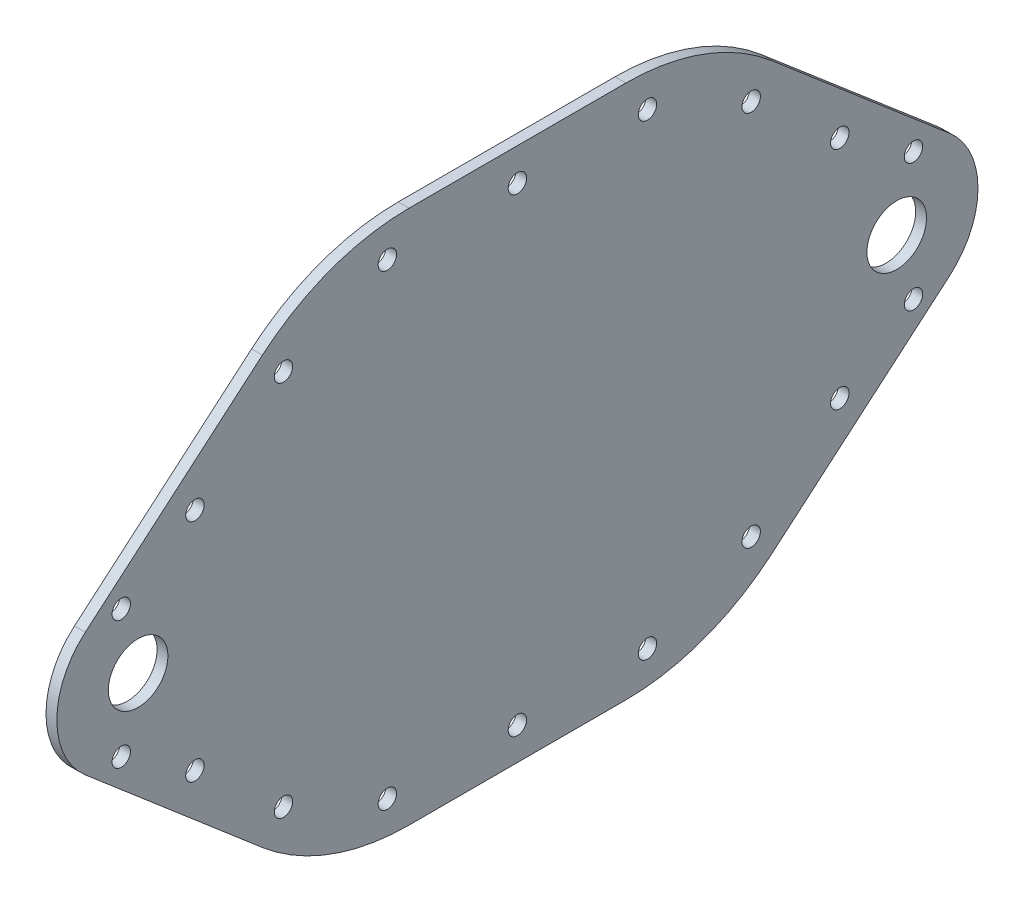
ISO-10303-21;
HEADER;
FILE_DESCRIPTION(('STEP AP214'),'2;1');
FILE_NAME('part.step','',(''),(''),'','','');
FILE_SCHEMA(('AUTOMOTIVE_DESIGN { 1 0 10303 214 1 1 1 1 }'));
ENDSEC;
DATA;
#1=APPLICATION_CONTEXT('core data for automotive mechanical design processes');
#2=APPLICATION_PROTOCOL_DEFINITION('international standard','automotive_design',2000,#1);
#3=PRODUCT_CONTEXT('',#1,'mechanical');
#4=PRODUCT('Part','Part','',(#3));
#5=PRODUCT_RELATED_PRODUCT_CATEGORY('part','',(#4));
#6=PRODUCT_DEFINITION_FORMATION('','',#4);
#7=PRODUCT_DEFINITION_CONTEXT('part definition',#1,'design');
#8=PRODUCT_DEFINITION('design','',#6,#7);
#9=PRODUCT_DEFINITION_SHAPE('','',#8);
#10=(LENGTH_UNIT() NAMED_UNIT(*) SI_UNIT(.MILLI.,.METRE.));
#11=(NAMED_UNIT(*) PLANE_ANGLE_UNIT() SI_UNIT($,.RADIAN.));
#12=(NAMED_UNIT(*) SI_UNIT($,.STERADIAN.) SOLID_ANGLE_UNIT());
#13=UNCERTAINTY_MEASURE_WITH_UNIT(LENGTH_MEASURE(1.E-05),#10,'distance_accuracy_value','');
#14=(GEOMETRIC_REPRESENTATION_CONTEXT(3) GLOBAL_UNCERTAINTY_ASSIGNED_CONTEXT((#13)) GLOBAL_UNIT_ASSIGNED_CONTEXT((#10,
#11,#12)) REPRESENTATION_CONTEXT('',''));
#15=CARTESIAN_POINT('',(0.,0.,0.));
#16=DIRECTION('',(0.,0.,1.));
#17=DIRECTION('',(1.,0.,0.));
#18=AXIS2_PLACEMENT_3D('',#15,#16,#17);
#19=CARTESIAN_POINT('',(2.54,0.,0.));
#20=DIRECTION('',(1.,0.,0.));
#21=DIRECTION('',(0.,0.,-1.));
#22=AXIS2_PLACEMENT_3D('',#19,#20,#21);
#23=PLANE('',#22);
#24=CARTESIAN_POINT('',(2.54,0.,88.9000000000001));
#25=DIRECTION('',(1.,0.,0.));
#26=DIRECTION('',(0.,0.,-1.));
#27=AXIS2_PLACEMENT_3D('',#24,#25,#26);
#28=CIRCLE('',#27,6.98500000000001);
#29=CARTESIAN_POINT('',(2.54,0.,81.915));
#30=VERTEX_POINT('',#29);
#31=EDGE_CURVE('E243',#30,#30,#28,.T.);
#32=ORIENTED_EDGE('',*,*,#31,.F.);
#33=EDGE_LOOP('',(#32));
#34=FACE_BOUND('',#33,.T.);
#35=CARTESIAN_POINT('',(2.54,-1.07621984650563E-05,-88.8999999999998));
#36=DIRECTION('',(1.,0.,0.));
#37=DIRECTION('',(0.,0.,-1.));
#38=AXIS2_PLACEMENT_3D('',#35,#36,#37);
#39=CIRCLE('',#38,6.985);
#40=CARTESIAN_POINT('',(2.54,-1.07621984650563E-05,-95.8849999999999));
#41=VERTEX_POINT('',#40);
#42=EDGE_CURVE('E251',#41,#41,#39,.T.);
#43=ORIENTED_EDGE('',*,*,#42,.F.);
#44=EDGE_LOOP('',(#43));
#45=FACE_BOUND('',#44,.T.);
#46=CARTESIAN_POINT('',(2.54,-26.429391703512,75.5809810842823));
#47=DIRECTION('',(1.,0.,0.));
#48=DIRECTION('',(0.,0.,-1.));
#49=AXIS2_PLACEMENT_3D('',#46,#47,#48);
#50=CIRCLE('',#49,2.15899999999999);
#51=CARTESIAN_POINT('',(2.54,-26.429391703512,73.4219810842823));
#52=VERTEX_POINT('',#51);
#53=EDGE_CURVE('E390',#52,#52,#50,.F.);
#54=ORIENTED_EDGE('',*,*,#53,.T.);
#55=EDGE_LOOP('',(#54));
#56=FACE_BOUND('',#55,.T.);
#57=CARTESIAN_POINT('',(2.54,-54.7061868360336,30.48));
#58=DIRECTION('',(1.,0.,0.));
#59=DIRECTION('',(0.,0.,-1.));
#60=AXIS2_PLACEMENT_3D('',#57,#58,#59);
#61=CIRCLE('',#60,2.159);
#62=CARTESIAN_POINT('',(2.54,-54.7061868360336,28.321));
#63=VERTEX_POINT('',#62);
#64=EDGE_CURVE('E382',#63,#63,#61,.F.);
#65=ORIENTED_EDGE('',*,*,#64,.T.);
#66=EDGE_LOOP('',(#65));
#67=FACE_BOUND('',#66,.T.);
#68=CARTESIAN_POINT('',(2.54,-54.7051733497009,-30.4786597987178));
#69=DIRECTION('',(1.,0.,0.));
#70=DIRECTION('',(0.,0.,-1.));
#71=AXIS2_PLACEMENT_3D('',#68,#69,#70);
#72=CIRCLE('',#71,2.159);
#73=CARTESIAN_POINT('',(2.54,-54.7051733497009,-32.6376597987178));
#74=VERTEX_POINT('',#73);
#75=EDGE_CURVE('E374',#74,#74,#72,.F.);
#76=ORIENTED_EDGE('',*,*,#75,.T.);
#77=EDGE_LOOP('',(#76));
#78=FACE_BOUND('',#77,.T.);
#79=CARTESIAN_POINT('',(2.54,-26.4222083162872,-75.5555530662178));
#80=DIRECTION('',(1.,0.,0.));
#81=DIRECTION('',(0.,0.,-1.));
#82=AXIS2_PLACEMENT_3D('',#79,#80,#81);
#83=CIRCLE('',#82,2.15899999999999);
#84=CARTESIAN_POINT('',(2.54,-26.4222083162872,-77.7145530662177));
#85=VERTEX_POINT('',#84);
#86=EDGE_CURVE('E366',#85,#85,#83,.F.);
#87=ORIENTED_EDGE('',*,*,#86,.T.);
#88=EDGE_LOOP('',(#87));
#89=FACE_BOUND('',#88,.T.);
#90=DIRECTION('',(0.,0.,-1.));
#91=VECTOR('',#90,1.);
#92=CARTESIAN_POINT('',(2.54,-62.611,0.));
#93=LINE('',#92,#91);
#94=CARTESIAN_POINT('',(2.54,-62.611,25.4));
#95=VERTEX_POINT('',#94);
#96=CARTESIAN_POINT('',(2.54,-62.611,-25.4));
#97=VERTEX_POINT('',#96);
#98=EDGE_CURVE('E213',#95,#97,#93,.T.);
#99=ORIENTED_EDGE('',*,*,#98,.T.);
#100=CARTESIAN_POINT('',(2.54,-9.72846158719064,-25.4));
#101=DIRECTION('',(1.,0.,0.));
#102=DIRECTION('',(0.,0.,-1.));
#103=AXIS2_PLACEMENT_3D('',#100,#101,#102);
#104=CIRCLE('',#103,52.8825384128097);
#105=CARTESIAN_POINT('',(2.54,-49.9468477681641,-59.7372142431561));
#106=VERTEX_POINT('',#105);
#107=EDGE_CURVE('E112',#97,#106,#104,.T.);
#108=ORIENTED_EDGE('',*,*,#107,.T.);
#109=DIRECTION('',(0.,-0.64931100650113,0.760522989025637));
#110=VECTOR('',#109,1.);
#111=CARTESIAN_POINT('',(2.54,-58.3882068959576,-49.850045211628));
#112=LINE('',#111,#110);
#113=CARTESIAN_POINT('',(2.54,-14.4879737031369,-101.269374673846));
#114=VERTEX_POINT('',#113);
#115=EDGE_CURVE('E405',#114,#106,#112,.T.);
#116=ORIENTED_EDGE('',*,*,#115,.F.);
#117=CARTESIAN_POINT('',(2.54,-1.07621984650563E-05,-88.8999999999998));
#118=DIRECTION('',(1.,0.,0.));
#119=DIRECTION('',(0.,0.,-1.));
#120=AXIS2_PLACEMENT_3D('',#117,#118,#119);
#121=CIRCLE('',#120,19.05);
#122=CARTESIAN_POINT('',(2.54,14.4879482101719,-101.269379322137));
#123=VERTEX_POINT('',#122);
#124=EDGE_CURVE('E409',#114,#123,#121,.T.);
#125=ORIENTED_EDGE('',*,*,#124,.T.);
#126=DIRECTION('',(0.,0.649311250505885,0.760522780701856));
#127=VECTOR('',#126,1.);
#128=CARTESIAN_POINT('',(2.54,58.3881949498325,-49.8500674005709));
#129=LINE('',#128,#127);
#130=CARTESIAN_POINT('',(2.54,49.9468356002987,-59.7372302680082));
#131=VERTEX_POINT('',#130);
#132=EDGE_CURVE('E412',#123,#131,#129,.T.);
#133=ORIENTED_EDGE('',*,*,#132,.T.);
#134=CARTESIAN_POINT('',(2.54,9.72845678015649,-25.4));
#135=DIRECTION('',(1.,0.,0.));
#136=DIRECTION('',(0.,0.,-1.));
#137=AXIS2_PLACEMENT_3D('',#134,#135,#136);
#138=CIRCLE('',#137,52.8825432198438);
#139=CARTESIAN_POINT('',(2.54,62.611,-25.4));
#140=VERTEX_POINT('',#139);
#141=EDGE_CURVE('E415',#140,#131,#138,.F.);
#142=ORIENTED_EDGE('',*,*,#141,.F.);
#143=DIRECTION('',(0.,0.,-1.));
#144=VECTOR('',#143,1.);
#145=CARTESIAN_POINT('',(2.54,62.611,0.));
#146=LINE('',#145,#144);
#147=CARTESIAN_POINT('',(2.54,62.611,25.4));
#148=VERTEX_POINT('',#147);
#149=EDGE_CURVE('E419',#148,#140,#146,.T.);
#150=ORIENTED_EDGE('',*,*,#149,.F.);
#151=CARTESIAN_POINT('',(2.54,9.5445076787761,25.4));
#152=DIRECTION('',(1.,0.,0.));
#153=DIRECTION('',(0.,0.,-1.));
#154=AXIS2_PLACEMENT_3D('',#151,#152,#153);
#155=CIRCLE('',#154,53.0664923212239);
#156=CARTESIAN_POINT('',(2.54,49.9702989821736,59.7774345286653));
#157=VERTEX_POINT('',#156);
#158=EDGE_CURVE('E423',#148,#157,#155,.T.);
#159=ORIENTED_EDGE('',*,*,#158,.T.);
#160=DIRECTION('',(0.,0.649923072370877,-0.76));
#161=VECTOR('',#160,1.);
#162=CARTESIAN_POINT('',(2.54,58.389402461666,49.9323945286652));
#163=LINE('',#162,#161);
#164=CARTESIAN_POINT('',(2.54,14.478,101.281034528665));
#165=VERTEX_POINT('',#164);
#166=EDGE_CURVE('E147',#165,#157,#163,.T.);
#167=ORIENTED_EDGE('',*,*,#166,.F.);
#168=CARTESIAN_POINT('',(2.54,0.,88.9000000000001));
#169=DIRECTION('',(1.,0.,0.));
#170=DIRECTION('',(0.,0.,-1.));
#171=AXIS2_PLACEMENT_3D('',#168,#169,#170);
#172=CIRCLE('',#171,19.05);
#173=CARTESIAN_POINT('',(2.54,-14.478,101.281034528665));
#174=VERTEX_POINT('',#173);
#175=EDGE_CURVE('E140',#165,#174,#172,.T.);
#176=ORIENTED_EDGE('',*,*,#175,.T.);
#177=DIRECTION('',(0.,-0.649923072370877,-0.76));
#178=VECTOR('',#177,1.);
#179=CARTESIAN_POINT('',(2.54,-58.389402461666,49.9323945286652));
#180=LINE('',#179,#178);
#181=CARTESIAN_POINT('',(2.54,-49.9702989821736,59.7774345286652));
#182=VERTEX_POINT('',#181);
#183=EDGE_CURVE('E145',#174,#182,#180,.T.);
#184=ORIENTED_EDGE('',*,*,#183,.T.);
#185=CARTESIAN_POINT('',(2.54,-9.54450767877604,25.4));
#186=DIRECTION('',(1.,0.,0.));
#187=DIRECTION('',(0.,0.,-1.));
#188=AXIS2_PLACEMENT_3D('',#185,#186,#187);
#189=CIRCLE('',#188,53.0664923212239);
#190=EDGE_CURVE('E163',#95,#182,#189,.F.);
#191=ORIENTED_EDGE('',*,*,#190,.F.);
#192=EDGE_LOOP('',(#99,#108,#116,#125,#133,#142,#150,#159,#167,#176,#184,#191));
#193=FACE_BOUND('',#192,.T.);
#194=CARTESIAN_POINT('',(2.54,44.1719834070241,54.8333414513654));
#195=DIRECTION('',(1.,0.,0.));
#196=DIRECTION('',(0.,0.,-1.));
#197=AXIS2_PLACEMENT_3D('',#194,#195,#196);
#198=CIRCLE('',#197,2.159);
#199=CARTESIAN_POINT('',(2.54,44.1719834070241,52.6743414513654));
#200=VERTEX_POINT('',#199);
#201=EDGE_CURVE('E330',#200,#200,#198,.T.);
#202=ORIENTED_EDGE('',*,*,#201,.F.);
#203=EDGE_LOOP('',(#202));
#204=FACE_BOUND('',#203,.T.);
#205=CARTESIAN_POINT('',(2.54,14.9993917035121,92.8529810842823));
#206=DIRECTION('',(1.,0.,0.));
#207=DIRECTION('',(0.,0.,-1.));
#208=AXIS2_PLACEMENT_3D('',#205,#206,#207);
#209=CIRCLE('',#208,2.15899999999999);
#210=CARTESIAN_POINT('',(2.54,14.9993917035121,90.6939810842823));
#211=VERTEX_POINT('',#210);
#212=EDGE_CURVE('E334',#211,#211,#209,.T.);
#213=ORIENTED_EDGE('',*,*,#212,.F.);
#214=EDGE_LOOP('',(#213));
#215=FACE_BOUND('',#214,.T.);
#216=CARTESIAN_POINT('',(2.54,54.7061868360336,30.48));
#217=DIRECTION('',(1.,0.,0.));
#218=DIRECTION('',(0.,0.,-1.));
#219=AXIS2_PLACEMENT_3D('',#216,#217,#218);
#220=CIRCLE('',#219,2.159);
#221=CARTESIAN_POINT('',(2.54,54.7061868360336,28.321));
#222=VERTEX_POINT('',#221);
#223=EDGE_CURVE('E338',#222,#222,#220,.T.);
#224=ORIENTED_EDGE('',*,*,#223,.F.);
#225=EDGE_LOOP('',(#224));
#226=FACE_BOUND('',#225,.T.);
#227=CARTESIAN_POINT('',(2.54,54.991,0.));
#228=DIRECTION('',(1.,0.,0.));
#229=DIRECTION('',(0.,0.,-1.));
#230=AXIS2_PLACEMENT_3D('',#227,#228,#229);
#231=CIRCLE('',#230,2.159);
#232=CARTESIAN_POINT('',(2.54,54.991,-2.15900000000001));
#233=VERTEX_POINT('',#232);
#234=EDGE_CURVE('E342',#233,#233,#231,.T.);
#235=ORIENTED_EDGE('',*,*,#234,.F.);
#236=EDGE_LOOP('',(#235));
#237=FACE_BOUND('',#236,.T.);
#238=CARTESIAN_POINT('',(2.54,54.7051733497009,-30.4786597987178));
#239=DIRECTION('',(1.,0.,0.));
#240=DIRECTION('',(0.,0.,-1.));
#241=AXIS2_PLACEMENT_3D('',#238,#239,#240);
#242=CIRCLE('',#241,2.159);
#243=CARTESIAN_POINT('',(2.54,54.7051733497009,-32.6376597987178));
#244=VERTEX_POINT('',#243);
#245=EDGE_CURVE('E346',#244,#244,#242,.T.);
#246=ORIENTED_EDGE('',*,*,#245,.F.);
#247=EDGE_LOOP('',(#246));
#248=FACE_BOUND('',#247,.T.);
#249=CARTESIAN_POINT('',(2.54,44.1516520113506,-54.7894785391533));
#250=DIRECTION('',(1.,0.,0.));
#251=DIRECTION('',(0.,0.,-1.));
#252=AXIS2_PLACEMENT_3D('',#249,#250,#251);
#253=CIRCLE('',#252,2.159);
#254=CARTESIAN_POINT('',(2.54,44.1516520113506,-56.9484785391533));
#255=VERTEX_POINT('',#254);
#256=EDGE_CURVE('E350',#255,#255,#253,.T.);
#257=ORIENTED_EDGE('',*,*,#256,.F.);
#258=EDGE_LOOP('',(#257));
#259=FACE_BOUND('',#258,.T.);
#260=CARTESIAN_POINT('',(2.54,26.4222083162872,-75.5555530662178));
#261=DIRECTION('',(1.,0.,0.));
#262=DIRECTION('',(0.,0.,-1.));
#263=AXIS2_PLACEMENT_3D('',#260,#261,#262);
#264=CIRCLE('',#263,2.15899999999999);
#265=CARTESIAN_POINT('',(2.54,26.4222083162872,-77.7145530662177));
#266=VERTEX_POINT('',#265);
#267=EDGE_CURVE('E354',#266,#266,#264,.T.);
#268=ORIENTED_EDGE('',*,*,#267,.F.);
#269=EDGE_LOOP('',(#268));
#270=FACE_BOUND('',#269,.T.);
#271=CARTESIAN_POINT('',(2.54,14.9922083162872,-92.8275530662178));
#272=DIRECTION('',(1.,0.,0.));
#273=DIRECTION('',(0.,0.,-1.));
#274=AXIS2_PLACEMENT_3D('',#271,#272,#273);
#275=CIRCLE('',#274,2.15899999999999);
#276=CARTESIAN_POINT('',(2.54,14.9922083162872,-94.9865530662178));
#277=VERTEX_POINT('',#276);
#278=EDGE_CURVE('E358',#277,#277,#275,.T.);
#279=ORIENTED_EDGE('',*,*,#278,.F.);
#280=EDGE_LOOP('',(#279));
#281=FACE_BOUND('',#280,.T.);
#282=CARTESIAN_POINT('',(2.54,-14.9922083162872,-92.8275530662178));
#283=DIRECTION('',(1.,0.,0.));
#284=DIRECTION('',(0.,0.,-1.));
#285=AXIS2_PLACEMENT_3D('',#282,#283,#284);
#286=CIRCLE('',#285,2.15899999999999);
#287=CARTESIAN_POINT('',(2.54,-14.9922083162872,-94.9865530662178));
#288=VERTEX_POINT('',#287);
#289=EDGE_CURVE('E362',#288,#288,#286,.F.);
#290=ORIENTED_EDGE('',*,*,#289,.T.);
#291=EDGE_LOOP('',(#290));
#292=FACE_BOUND('',#291,.T.);
#293=CARTESIAN_POINT('',(2.54,-44.1516520113506,-54.7894785391533));
#294=DIRECTION('',(1.,0.,0.));
#295=DIRECTION('',(0.,0.,-1.));
#296=AXIS2_PLACEMENT_3D('',#293,#294,#295);
#297=CIRCLE('',#296,2.159);
#298=CARTESIAN_POINT('',(2.54,-44.1516520113506,-56.9484785391533));
#299=VERTEX_POINT('',#298);
#300=EDGE_CURVE('E370',#299,#299,#297,.F.);
#301=ORIENTED_EDGE('',*,*,#300,.T.);
#302=EDGE_LOOP('',(#301));
#303=FACE_BOUND('',#302,.T.);
#304=CARTESIAN_POINT('',(2.54,-54.991,0.));
#305=DIRECTION('',(1.,0.,0.));
#306=DIRECTION('',(0.,0.,-1.));
#307=AXIS2_PLACEMENT_3D('',#304,#305,#306);
#308=CIRCLE('',#307,2.159);
#309=CARTESIAN_POINT('',(2.54,-54.991,-2.15900000000001));
#310=VERTEX_POINT('',#309);
#311=EDGE_CURVE('E378',#310,#310,#308,.F.);
#312=ORIENTED_EDGE('',*,*,#311,.T.);
#313=EDGE_LOOP('',(#312));
#314=FACE_BOUND('',#313,.T.);
#315=CARTESIAN_POINT('',(2.54,-44.1719834070329,54.833341451355));
#316=DIRECTION('',(1.,0.,0.));
#317=DIRECTION('',(0.,0.,-1.));
#318=AXIS2_PLACEMENT_3D('',#315,#316,#317);
#319=CIRCLE('',#318,2.159);
#320=CARTESIAN_POINT('',(2.54,-44.1719834070329,52.674341451355));
#321=VERTEX_POINT('',#320);
#322=EDGE_CURVE('E386',#321,#321,#319,.F.);
#323=ORIENTED_EDGE('',*,*,#322,.T.);
#324=EDGE_LOOP('',(#323));
#325=FACE_BOUND('',#324,.T.);
#326=CARTESIAN_POINT('',(2.54,26.429391703512,75.5809810842823));
#327=DIRECTION('',(1.,0.,0.));
#328=DIRECTION('',(0.,0.,-1.));
#329=AXIS2_PLACEMENT_3D('',#326,#327,#328);
#330=CIRCLE('',#329,2.15899999999999);
#331=CARTESIAN_POINT('',(2.54,26.429391703512,73.4219810842823));
#332=VERTEX_POINT('',#331);
#333=EDGE_CURVE('E394',#332,#332,#330,.T.);
#334=ORIENTED_EDGE('',*,*,#333,.F.);
#335=EDGE_LOOP('',(#334));
#336=FACE_BOUND('',#335,.T.);
#337=CARTESIAN_POINT('',(2.54,-14.9993917035121,92.8529810842823));
#338=DIRECTION('',(1.,0.,0.));
#339=DIRECTION('',(0.,0.,-1.));
#340=AXIS2_PLACEMENT_3D('',#337,#338,#339);
#341=CIRCLE('',#340,2.15899999999999);
#342=CARTESIAN_POINT('',(2.54,-14.9993917035121,90.6939810842823));
#343=VERTEX_POINT('',#342);
#344=EDGE_CURVE('E173',#343,#343,#341,.F.);
#345=ORIENTED_EDGE('',*,*,#344,.T.);
#346=EDGE_LOOP('',(#345));
#347=FACE_BOUND('',#346,.T.);
#348=ADVANCED_FACE('F41',(#34,#45,#56,#67,#78,#89,#193,#204,#215,#226,#237,#248,#259,#270,#281,
#292,#303,#314,#325,#336,#347),#23,.T.);
#349=CARTESIAN_POINT('',(0.,0.,0.));
#350=DIRECTION('',(1.,0.,0.));
#351=DIRECTION('',(0.,0.,-1.));
#352=AXIS2_PLACEMENT_3D('',#349,#350,#351);
#353=PLANE('',#352);
#354=CARTESIAN_POINT('',(0.,0.,88.9000000000001));
#355=DIRECTION('',(1.,0.,0.));
#356=DIRECTION('',(0.,0.,-1.));
#357=AXIS2_PLACEMENT_3D('',#354,#355,#356);
#358=CIRCLE('',#357,6.98500000000001);
#359=CARTESIAN_POINT('',(0.,0.,81.915));
#360=VERTEX_POINT('',#359);
#361=EDGE_CURVE('E45',#360,#360,#358,.T.);
#362=ORIENTED_EDGE('',*,*,#361,.T.);
#363=EDGE_LOOP('',(#362));
#364=FACE_BOUND('',#363,.T.);
#365=CARTESIAN_POINT('',(0.,-1.07621984650563E-05,-88.8999999999998));
#366=DIRECTION('',(1.,0.,0.));
#367=DIRECTION('',(0.,0.,-1.));
#368=AXIS2_PLACEMENT_3D('',#365,#366,#367);
#369=CIRCLE('',#368,6.985);
#370=CARTESIAN_POINT('',(0.,-1.07621984650563E-05,-95.8849999999999));
#371=VERTEX_POINT('',#370);
#372=EDGE_CURVE('E240',#371,#371,#369,.T.);
#373=ORIENTED_EDGE('',*,*,#372,.T.);
#374=EDGE_LOOP('',(#373));
#375=FACE_BOUND('',#374,.T.);
#376=CARTESIAN_POINT('',(0.,26.429391703512,75.5809810842823));
#377=DIRECTION('',(1.,0.,0.));
#378=DIRECTION('',(0.,0.,-1.));
#379=AXIS2_PLACEMENT_3D('',#376,#377,#378);
#380=CIRCLE('',#379,2.15899999999999);
#381=CARTESIAN_POINT('',(0.,26.429391703512,73.4219810842823));
#382=VERTEX_POINT('',#381);
#383=EDGE_CURVE('E288',#382,#382,#380,.T.);
#384=ORIENTED_EDGE('',*,*,#383,.T.);
#385=EDGE_LOOP('',(#384));
#386=FACE_BOUND('',#385,.T.);
#387=CARTESIAN_POINT('',(0.,14.9922083162872,-92.8275530662178));
#388=DIRECTION('',(1.,0.,0.));
#389=DIRECTION('',(0.,0.,-1.));
#390=AXIS2_PLACEMENT_3D('',#387,#388,#389);
#391=CIRCLE('',#390,2.15899999999999);
#392=CARTESIAN_POINT('',(0.,14.9922083162872,-94.9865530662178));
#393=VERTEX_POINT('',#392);
#394=EDGE_CURVE('E316',#393,#393,#391,.T.);
#395=ORIENTED_EDGE('',*,*,#394,.T.);
#396=EDGE_LOOP('',(#395));
#397=FACE_BOUND('',#396,.T.);
#398=CARTESIAN_POINT('',(0.,26.4222083162872,-75.5555530662178));
#399=DIRECTION('',(1.,0.,0.));
#400=DIRECTION('',(0.,0.,-1.));
#401=AXIS2_PLACEMENT_3D('',#398,#399,#400);
#402=CIRCLE('',#401,2.15899999999999);
#403=CARTESIAN_POINT('',(0.,26.4222083162872,-77.7145530662177));
#404=VERTEX_POINT('',#403);
#405=EDGE_CURVE('E312',#404,#404,#402,.T.);
#406=ORIENTED_EDGE('',*,*,#405,.T.);
#407=EDGE_LOOP('',(#406));
#408=FACE_BOUND('',#407,.T.);
#409=CARTESIAN_POINT('',(0.,44.1516520113506,-54.7894785391533));
#410=DIRECTION('',(1.,0.,0.));
#411=DIRECTION('',(0.,0.,-1.));
#412=AXIS2_PLACEMENT_3D('',#409,#410,#411);
#413=CIRCLE('',#412,2.159);
#414=CARTESIAN_POINT('',(0.,44.1516520113506,-56.9484785391533));
#415=VERTEX_POINT('',#414);
#416=EDGE_CURVE('E308',#415,#415,#413,.T.);
#417=ORIENTED_EDGE('',*,*,#416,.T.);
#418=EDGE_LOOP('',(#417));
#419=FACE_BOUND('',#418,.T.);
#420=CARTESIAN_POINT('',(0.,54.7051733497009,-30.4786597987178));
#421=DIRECTION('',(1.,0.,0.));
#422=DIRECTION('',(0.,0.,-1.));
#423=AXIS2_PLACEMENT_3D('',#420,#421,#422);
#424=CIRCLE('',#423,2.159);
#425=CARTESIAN_POINT('',(0.,54.7051733497009,-32.6376597987178));
#426=VERTEX_POINT('',#425);
#427=EDGE_CURVE('E304',#426,#426,#424,.T.);
#428=ORIENTED_EDGE('',*,*,#427,.T.);
#429=EDGE_LOOP('',(#428));
#430=FACE_BOUND('',#429,.T.);
#431=CARTESIAN_POINT('',(0.,54.991,0.));
#432=DIRECTION('',(1.,0.,0.));
#433=DIRECTION('',(0.,0.,-1.));
#434=AXIS2_PLACEMENT_3D('',#431,#432,#433);
#435=CIRCLE('',#434,2.159);
#436=CARTESIAN_POINT('',(0.,54.991,-2.15900000000001));
#437=VERTEX_POINT('',#436);
#438=EDGE_CURVE('E300',#437,#437,#435,.T.);
#439=ORIENTED_EDGE('',*,*,#438,.T.);
#440=EDGE_LOOP('',(#439));
#441=FACE_BOUND('',#440,.T.);
#442=CARTESIAN_POINT('',(0.,54.7061868360336,30.48));
#443=DIRECTION('',(1.,0.,0.));
#444=DIRECTION('',(0.,0.,-1.));
#445=AXIS2_PLACEMENT_3D('',#442,#443,#444);
#446=CIRCLE('',#445,2.159);
#447=CARTESIAN_POINT('',(0.,54.7061868360336,28.321));
#448=VERTEX_POINT('',#447);
#449=EDGE_CURVE('E295',#448,#448,#446,.T.);
#450=ORIENTED_EDGE('',*,*,#449,.T.);
#451=EDGE_LOOP('',(#450));
#452=FACE_BOUND('',#451,.T.);
#453=CARTESIAN_POINT('',(0.,14.9993917035121,92.8529810842823));
#454=DIRECTION('',(1.,0.,0.));
#455=DIRECTION('',(0.,0.,-1.));
#456=AXIS2_PLACEMENT_3D('',#453,#454,#455);
#457=CIRCLE('',#456,2.15899999999999);
#458=CARTESIAN_POINT('',(0.,14.9993917035121,90.6939810842823));
#459=VERTEX_POINT('',#458);
#460=EDGE_CURVE('E249',#459,#459,#457,.T.);
#461=ORIENTED_EDGE('',*,*,#460,.T.);
#462=EDGE_LOOP('',(#461));
#463=FACE_BOUND('',#462,.T.);
#464=CARTESIAN_POINT('',(0.,44.1719834070241,54.8333414513654));
#465=DIRECTION('',(1.,0.,0.));
#466=DIRECTION('',(0.,0.,-1.));
#467=AXIS2_PLACEMENT_3D('',#464,#465,#466);
#468=CIRCLE('',#467,2.159);
#469=CARTESIAN_POINT('',(0.,44.1719834070241,52.6743414513654));
#470=VERTEX_POINT('',#469);
#471=EDGE_CURVE('E299',#470,#470,#468,.T.);
#472=ORIENTED_EDGE('',*,*,#471,.T.);
#473=EDGE_LOOP('',(#472));
#474=FACE_BOUND('',#473,.T.);
#475=DIRECTION('',(0.,0.,-1.));
#476=VECTOR('',#475,1.);
#477=CARTESIAN_POINT('',(0.,-62.611,0.));
#478=LINE('',#477,#476);
#479=CARTESIAN_POINT('',(0.,-62.611,25.4));
#480=VERTEX_POINT('',#479);
#481=CARTESIAN_POINT('',(0.,-62.611,-25.4));
#482=VERTEX_POINT('',#481);
#483=EDGE_CURVE('E169',#480,#482,#478,.T.);
#484=ORIENTED_EDGE('',*,*,#483,.F.);
#485=CARTESIAN_POINT('',(0.,-9.54450767877604,25.4));
#486=DIRECTION('',(1.,0.,0.));
#487=DIRECTION('',(0.,0.,-1.));
#488=AXIS2_PLACEMENT_3D('',#485,#486,#487);
#489=CIRCLE('',#488,53.0664923212239);
#490=CARTESIAN_POINT('',(0.,-49.9702989821736,59.7774345286652));
#491=VERTEX_POINT('',#490);
#492=EDGE_CURVE('E209',#480,#491,#489,.F.);
#493=ORIENTED_EDGE('',*,*,#492,.T.);
#494=DIRECTION('',(0.,-0.649923072370877,-0.76));
#495=VECTOR('',#494,1.);
#496=CARTESIAN_POINT('',(0.,-58.389402461666,49.9323945286652));
#497=LINE('',#496,#495);
#498=CARTESIAN_POINT('',(0.,-14.478,101.281034528665));
#499=VERTEX_POINT('',#498);
#500=EDGE_CURVE('E206',#499,#491,#497,.T.);
#501=ORIENTED_EDGE('',*,*,#500,.F.);
#502=CARTESIAN_POINT('',(0.,0.,88.9000000000001));
#503=DIRECTION('',(1.,0.,0.));
#504=DIRECTION('',(0.,0.,-1.));
#505=AXIS2_PLACEMENT_3D('',#502,#503,#504);
#506=CIRCLE('',#505,19.05);
#507=CARTESIAN_POINT('',(0.,14.478,101.281034528665));
#508=VERTEX_POINT('',#507);
#509=EDGE_CURVE('E155',#508,#499,#506,.T.);
#510=ORIENTED_EDGE('',*,*,#509,.F.);
#511=DIRECTION('',(0.,0.649923072370877,-0.76));
#512=VECTOR('',#511,1.);
#513=CARTESIAN_POINT('',(0.,58.389402461666,49.9323945286652));
#514=LINE('',#513,#512);
#515=CARTESIAN_POINT('',(0.,49.9702989821736,59.7774345286653));
#516=VERTEX_POINT('',#515);
#517=EDGE_CURVE('E200',#508,#516,#514,.T.);
#518=ORIENTED_EDGE('',*,*,#517,.T.);
#519=CARTESIAN_POINT('',(0.,9.5445076787761,25.4));
#520=DIRECTION('',(1.,0.,0.));
#521=DIRECTION('',(0.,0.,-1.));
#522=AXIS2_PLACEMENT_3D('',#519,#520,#521);
#523=CIRCLE('',#522,53.0664923212239);
#524=CARTESIAN_POINT('',(0.,62.611,25.4));
#525=VERTEX_POINT('',#524);
#526=EDGE_CURVE('E196',#525,#516,#523,.T.);
#527=ORIENTED_EDGE('',*,*,#526,.F.);
#528=DIRECTION('',(0.,0.,-1.));
#529=VECTOR('',#528,1.);
#530=CARTESIAN_POINT('',(0.,62.611,0.));
#531=LINE('',#530,#529);
#532=CARTESIAN_POINT('',(0.,62.611,-25.4));
#533=VERTEX_POINT('',#532);
#534=EDGE_CURVE('E192',#525,#533,#531,.T.);
#535=ORIENTED_EDGE('',*,*,#534,.T.);
#536=CARTESIAN_POINT('',(0.,9.72845678015649,-25.4));
#537=DIRECTION('',(1.,0.,0.));
#538=DIRECTION('',(0.,0.,-1.));
#539=AXIS2_PLACEMENT_3D('',#536,#537,#538);
#540=CIRCLE('',#539,52.8825432198438);
#541=CARTESIAN_POINT('',(0.,49.9468356002987,-59.7372302680082));
#542=VERTEX_POINT('',#541);
#543=EDGE_CURVE('E188',#533,#542,#540,.F.);
#544=ORIENTED_EDGE('',*,*,#543,.T.);
#545=DIRECTION('',(0.,0.649311250505885,0.760522780701856));
#546=VECTOR('',#545,1.);
#547=CARTESIAN_POINT('',(0.,58.3881949498325,-49.8500674005709));
#548=LINE('',#547,#546);
#549=CARTESIAN_POINT('',(0.,14.4879482101719,-101.269379322137));
#550=VERTEX_POINT('',#549);
#551=EDGE_CURVE('E184',#550,#542,#548,.T.);
#552=ORIENTED_EDGE('',*,*,#551,.F.);
#553=CARTESIAN_POINT('',(0.,-1.07621984650563E-05,-88.8999999999998));
#554=DIRECTION('',(1.,0.,0.));
#555=DIRECTION('',(0.,0.,-1.));
#556=AXIS2_PLACEMENT_3D('',#553,#554,#555);
#557=CIRCLE('',#556,19.05);
#558=CARTESIAN_POINT('',(0.,-14.4879737031369,-101.269374673846));
#559=VERTEX_POINT('',#558);
#560=EDGE_CURVE('E181',#559,#550,#557,.T.);
#561=ORIENTED_EDGE('',*,*,#560,.F.);
#562=DIRECTION('',(0.,-0.64931100650113,0.760522989025637));
#563=VECTOR('',#562,1.);
#564=CARTESIAN_POINT('',(0.,-58.3882068959576,-49.850045211628));
#565=LINE('',#564,#563);
#566=CARTESIAN_POINT('',(0.,-49.9468477681641,-59.7372142431561));
#567=VERTEX_POINT('',#566);
#568=EDGE_CURVE('E177',#559,#567,#565,.T.);
#569=ORIENTED_EDGE('',*,*,#568,.T.);
#570=CARTESIAN_POINT('',(0.,-9.72846158719064,-25.4));
#571=DIRECTION('',(1.,0.,0.));
#572=DIRECTION('',(0.,0.,-1.));
#573=AXIS2_PLACEMENT_3D('',#570,#571,#572);
#574=CIRCLE('',#573,52.8825384128097);
#575=EDGE_CURVE('E172',#482,#567,#574,.T.);
#576=ORIENTED_EDGE('',*,*,#575,.F.);
#577=EDGE_LOOP('',(#484,#493,#501,#510,#518,#527,#535,#544,#552,#561,#569,#576));
#578=FACE_BOUND('',#577,.T.);
#579=CARTESIAN_POINT('',(0.,-14.9922083162872,-92.8275530662178));
#580=DIRECTION('',(-1.,0.,0.));
#581=DIRECTION('',(0.,0.,1.));
#582=AXIS2_PLACEMENT_3D('',#579,#580,#581);
#583=CIRCLE('',#582,2.15899999999999);
#584=CARTESIAN_POINT('',(0.,-14.9922083162872,-90.6685530662178));
#585=VERTEX_POINT('',#584);
#586=EDGE_CURVE('E320',#585,#585,#583,.T.);
#587=ORIENTED_EDGE('',*,*,#586,.F.);
#588=EDGE_LOOP('',(#587));
#589=FACE_BOUND('',#588,.T.);
#590=CARTESIAN_POINT('',(0.,-26.4222083162872,-75.5555530662178));
#591=DIRECTION('',(-1.,0.,0.));
#592=DIRECTION('',(0.,0.,1.));
#593=AXIS2_PLACEMENT_3D('',#590,#591,#592);
#594=CIRCLE('',#593,2.15899999999999);
#595=CARTESIAN_POINT('',(0.,-26.4222083162872,-73.3965530662178));
#596=VERTEX_POINT('',#595);
#597=EDGE_CURVE('E267',#596,#596,#594,.T.);
#598=ORIENTED_EDGE('',*,*,#597,.F.);
#599=EDGE_LOOP('',(#598));
#600=FACE_BOUND('',#599,.T.);
#601=CARTESIAN_POINT('',(0.,-44.1516520113506,-54.7894785391533));
#602=DIRECTION('',(-1.,0.,0.));
#603=DIRECTION('',(0.,0.,1.));
#604=AXIS2_PLACEMENT_3D('',#601,#602,#603);
#605=CIRCLE('',#604,2.159);
#606=CARTESIAN_POINT('',(0.,-44.1516520113506,-52.6304785391533));
#607=VERTEX_POINT('',#606);
#608=EDGE_CURVE('E263',#607,#607,#605,.T.);
#609=ORIENTED_EDGE('',*,*,#608,.F.);
#610=EDGE_LOOP('',(#609));
#611=FACE_BOUND('',#610,.T.);
#612=CARTESIAN_POINT('',(0.,-54.7051733497009,-30.4786597987178));
#613=DIRECTION('',(-1.,0.,0.));
#614=DIRECTION('',(0.,0.,1.));
#615=AXIS2_PLACEMENT_3D('',#612,#613,#614);
#616=CIRCLE('',#615,2.159);
#617=CARTESIAN_POINT('',(0.,-54.7051733497009,-28.3196597987178));
#618=VERTEX_POINT('',#617);
#619=EDGE_CURVE('E268',#618,#618,#616,.T.);
#620=ORIENTED_EDGE('',*,*,#619,.F.);
#621=EDGE_LOOP('',(#620));
#622=FACE_BOUND('',#621,.T.);
#623=CARTESIAN_POINT('',(0.,-54.991,0.));
#624=DIRECTION('',(-1.,0.,0.));
#625=DIRECTION('',(0.,0.,1.));
#626=AXIS2_PLACEMENT_3D('',#623,#624,#625);
#627=CIRCLE('',#626,2.159);
#628=CARTESIAN_POINT('',(0.,-54.991,2.15899999999999));
#629=VERTEX_POINT('',#628);
#630=EDGE_CURVE('E272',#629,#629,#627,.T.);
#631=ORIENTED_EDGE('',*,*,#630,.F.);
#632=EDGE_LOOP('',(#631));
#633=FACE_BOUND('',#632,.T.);
#634=CARTESIAN_POINT('',(0.,-54.7061868360336,30.48));
#635=DIRECTION('',(-1.,0.,0.));
#636=DIRECTION('',(0.,0.,1.));
#637=AXIS2_PLACEMENT_3D('',#634,#635,#636);
#638=CIRCLE('',#637,2.159);
#639=CARTESIAN_POINT('',(0.,-54.7061868360336,32.639));
#640=VERTEX_POINT('',#639);
#641=EDGE_CURVE('E276',#640,#640,#638,.T.);
#642=ORIENTED_EDGE('',*,*,#641,.F.);
#643=EDGE_LOOP('',(#642));
#644=FACE_BOUND('',#643,.T.);
#645=CARTESIAN_POINT('',(0.,-44.1719834070329,54.833341451355));
#646=DIRECTION('',(-1.,0.,0.));
#647=DIRECTION('',(0.,0.,1.));
#648=AXIS2_PLACEMENT_3D('',#645,#646,#647);
#649=CIRCLE('',#648,2.159);
#650=CARTESIAN_POINT('',(0.,-44.1719834070329,56.992341451355));
#651=VERTEX_POINT('',#650);
#652=EDGE_CURVE('E280',#651,#651,#649,.T.);
#653=ORIENTED_EDGE('',*,*,#652,.F.);
#654=EDGE_LOOP('',(#653));
#655=FACE_BOUND('',#654,.T.);
#656=CARTESIAN_POINT('',(0.,-26.429391703512,75.5809810842823));
#657=DIRECTION('',(-1.,0.,0.));
#658=DIRECTION('',(0.,0.,1.));
#659=AXIS2_PLACEMENT_3D('',#656,#657,#658);
#660=CIRCLE('',#659,2.15899999999999);
#661=CARTESIAN_POINT('',(0.,-26.429391703512,77.7399810842823));
#662=VERTEX_POINT('',#661);
#663=EDGE_CURVE('E284',#662,#662,#660,.T.);
#664=ORIENTED_EDGE('',*,*,#663,.F.);
#665=EDGE_LOOP('',(#664));
#666=FACE_BOUND('',#665,.T.);
#667=CARTESIAN_POINT('',(0.,-14.9993917035121,92.8529810842823));
#668=DIRECTION('',(-1.,0.,0.));
#669=DIRECTION('',(0.,0.,1.));
#670=AXIS2_PLACEMENT_3D('',#667,#668,#669);
#671=CIRCLE('',#670,2.15899999999999);
#672=CARTESIAN_POINT('',(0.,-14.9993917035121,95.0119810842823));
#673=VERTEX_POINT('',#672);
#674=EDGE_CURVE('E262',#673,#673,#671,.T.);
#675=ORIENTED_EDGE('',*,*,#674,.F.);
#676=EDGE_LOOP('',(#675));
#677=FACE_BOUND('',#676,.T.);
#678=ADVANCED_FACE('F431',(#364,#375,#386,#397,#408,#419,#430,#441,#452,#463,#474,#578,#589,
#600,#611,#622,#633,#644,#655,#666,#677),#353,.F.);
#679=CARTESIAN_POINT('',(2.54,-62.611,0.));
#680=DIRECTION('',(0.,1.,0.));
#681=DIRECTION('',(0.,0.,1.));
#682=AXIS2_PLACEMENT_3D('',#679,#680,#681);
#683=PLANE('',#682);
#684=ORIENTED_EDGE('',*,*,#483,.T.);
#685=DIRECTION('',(-1.,0.,0.));
#686=VECTOR('',#685,1.);
#687=CARTESIAN_POINT('',(2.54,-62.611,-25.4));
#688=LINE('',#687,#686);
#689=EDGE_CURVE('E11',#97,#482,#688,.T.);
#690=ORIENTED_EDGE('',*,*,#689,.F.);
#691=ORIENTED_EDGE('',*,*,#98,.F.);
#692=DIRECTION('',(-1.,0.,0.));
#693=VECTOR('',#692,1.);
#694=CARTESIAN_POINT('',(2.54,-62.611,25.4));
#695=LINE('',#694,#693);
#696=EDGE_CURVE('E61',#95,#480,#695,.T.);
#697=ORIENTED_EDGE('',*,*,#696,.T.);
#698=EDGE_LOOP('',(#684,#690,#691,#697));
#699=FACE_BOUND('',#698,.T.);
#700=ADVANCED_FACE('F43',(#699),#683,.F.);
#701=CARTESIAN_POINT('',(2.54,-9.72846158719064,-25.4));
#702=DIRECTION('',(-1.,0.,0.));
#703=DIRECTION('',(0.,0.,1.));
#704=AXIS2_PLACEMENT_3D('',#701,#702,#703);
#705=CYLINDRICAL_SURFACE('',#704,52.8825384128097);
#706=ORIENTED_EDGE('',*,*,#575,.T.);
#707=DIRECTION('',(-1.,0.,0.));
#708=VECTOR('',#707,1.);
#709=CARTESIAN_POINT('',(2.54,-49.9468477681641,-59.7372142431561));
#710=LINE('',#709,#708);
#711=EDGE_CURVE('E52',#106,#567,#710,.T.);
#712=ORIENTED_EDGE('',*,*,#711,.F.);
#713=ORIENTED_EDGE('',*,*,#107,.F.);
#714=ORIENTED_EDGE('',*,*,#689,.T.);
#715=EDGE_LOOP('',(#706,#712,#713,#714));
#716=FACE_BOUND('',#715,.T.);
#717=ADVANCED_FACE('F725',(#716),#705,.T.);
#718=CARTESIAN_POINT('',(2.54,-58.3882068959576,-49.850045211628));
#719=DIRECTION('',(0.,-0.760522989025637,-0.64931100650113));
#720=DIRECTION('',(0.,0.64931100650113,-0.760522989025637));
#721=AXIS2_PLACEMENT_3D('',#718,#719,#720);
#722=PLANE('',#721);
#723=ORIENTED_EDGE('',*,*,#568,.F.);
#724=DIRECTION('',(-1.,0.,0.));
#725=VECTOR('',#724,1.);
#726=CARTESIAN_POINT('',(2.54,-14.4879737031369,-101.269374673846));
#727=LINE('',#726,#725);
#728=EDGE_CURVE('E236',#114,#559,#727,.T.);
#729=ORIENTED_EDGE('',*,*,#728,.F.);
#730=ORIENTED_EDGE('',*,*,#115,.T.);
#731=ORIENTED_EDGE('',*,*,#711,.T.);
#732=EDGE_LOOP('',(#723,#729,#730,#731));
#733=FACE_BOUND('',#732,.T.);
#734=ADVANCED_FACE('F715',(#733),#722,.T.);
#735=CARTESIAN_POINT('',(2.54,-1.07621984650563E-05,-88.8999999999998));
#736=DIRECTION('',(-1.,0.,0.));
#737=DIRECTION('',(0.,0.,1.));
#738=AXIS2_PLACEMENT_3D('',#735,#736,#737);
#739=CYLINDRICAL_SURFACE('',#738,19.05);
#740=ORIENTED_EDGE('',*,*,#560,.T.);
#741=DIRECTION('',(-1.,0.,0.));
#742=VECTOR('',#741,1.);
#743=CARTESIAN_POINT('',(2.54,14.4879482101719,-101.269379322137));
#744=LINE('',#743,#742);
#745=EDGE_CURVE('E232',#123,#550,#744,.T.);
#746=ORIENTED_EDGE('',*,*,#745,.F.);
#747=ORIENTED_EDGE('',*,*,#124,.F.);
#748=ORIENTED_EDGE('',*,*,#728,.T.);
#749=EDGE_LOOP('',(#740,#746,#747,#748));
#750=FACE_BOUND('',#749,.T.);
#751=ADVANCED_FACE('F705',(#750),#739,.T.);
#752=CARTESIAN_POINT('',(2.54,58.3881949498325,-49.8500674005709));
#753=DIRECTION('',(0.,-0.760522780701856,0.649311250505885));
#754=DIRECTION('',(0.,-0.649311250505885,-0.760522780701856));
#755=AXIS2_PLACEMENT_3D('',#752,#753,#754);
#756=PLANE('',#755);
#757=ORIENTED_EDGE('',*,*,#551,.T.);
#758=DIRECTION('',(-1.,0.,0.));
#759=VECTOR('',#758,1.);
#760=CARTESIAN_POINT('',(2.54,49.9468356002987,-59.7372302680082));
#761=LINE('',#760,#759);
#762=EDGE_CURVE('E229',#131,#542,#761,.T.);
#763=ORIENTED_EDGE('',*,*,#762,.F.);
#764=ORIENTED_EDGE('',*,*,#132,.F.);
#765=ORIENTED_EDGE('',*,*,#745,.T.);
#766=EDGE_LOOP('',(#757,#763,#764,#765));
#767=FACE_BOUND('',#766,.T.);
#768=ADVANCED_FACE('F695',(#767),#756,.F.);
#769=CARTESIAN_POINT('',(2.54,9.72845678015649,-25.4));
#770=DIRECTION('',(-1.,0.,0.));
#771=DIRECTION('',(0.,0.,1.));
#772=AXIS2_PLACEMENT_3D('',#769,#770,#771);
#773=CYLINDRICAL_SURFACE('',#772,52.8825432198438);
#774=ORIENTED_EDGE('',*,*,#543,.F.);
#775=DIRECTION('',(-1.,0.,0.));
#776=VECTOR('',#775,1.);
#777=CARTESIAN_POINT('',(2.54,62.611,-25.4));
#778=LINE('',#777,#776);
#779=EDGE_CURVE('E226',#140,#533,#778,.T.);
#780=ORIENTED_EDGE('',*,*,#779,.F.);
#781=ORIENTED_EDGE('',*,*,#141,.T.);
#782=ORIENTED_EDGE('',*,*,#762,.T.);
#783=EDGE_LOOP('',(#774,#780,#781,#782));
#784=FACE_BOUND('',#783,.T.);
#785=ADVANCED_FACE('F685',(#784),#773,.T.);
#786=CARTESIAN_POINT('',(2.54,62.611,0.));
#787=DIRECTION('',(0.,1.,0.));
#788=DIRECTION('',(0.,0.,1.));
#789=AXIS2_PLACEMENT_3D('',#786,#787,#788);
#790=PLANE('',#789);
#791=ORIENTED_EDGE('',*,*,#534,.F.);
#792=DIRECTION('',(-1.,0.,0.));
#793=VECTOR('',#792,1.);
#794=CARTESIAN_POINT('',(2.54,62.611,25.4));
#795=LINE('',#794,#793);
#796=EDGE_CURVE('E223',#148,#525,#795,.T.);
#797=ORIENTED_EDGE('',*,*,#796,.F.);
#798=ORIENTED_EDGE('',*,*,#149,.T.);
#799=ORIENTED_EDGE('',*,*,#779,.T.);
#800=EDGE_LOOP('',(#791,#797,#798,#799));
#801=FACE_BOUND('',#800,.T.);
#802=ADVANCED_FACE('F675',(#801),#790,.T.);
#803=CARTESIAN_POINT('',(2.54,9.5445076787761,25.4));
#804=DIRECTION('',(-1.,0.,0.));
#805=DIRECTION('',(0.,0.,1.));
#806=AXIS2_PLACEMENT_3D('',#803,#804,#805);
#807=CYLINDRICAL_SURFACE('',#806,53.0664923212239);
#808=ORIENTED_EDGE('',*,*,#526,.T.);
#809=DIRECTION('',(-1.,0.,0.));
#810=VECTOR('',#809,1.);
#811=CARTESIAN_POINT('',(2.54,49.9702989821736,59.7774345286653));
#812=LINE('',#811,#810);
#813=EDGE_CURVE('E220',#157,#516,#812,.T.);
#814=ORIENTED_EDGE('',*,*,#813,.F.);
#815=ORIENTED_EDGE('',*,*,#158,.F.);
#816=ORIENTED_EDGE('',*,*,#796,.T.);
#817=EDGE_LOOP('',(#808,#814,#815,#816));
#818=FACE_BOUND('',#817,.T.);
#819=ADVANCED_FACE('F666',(#818),#807,.T.);
#820=CARTESIAN_POINT('',(2.54,58.389402461666,49.9323945286652));
#821=DIRECTION('',(0.,0.76,0.649923072370877));
#822=DIRECTION('',(0.,-0.649923072370877,0.76));
#823=AXIS2_PLACEMENT_3D('',#820,#821,#822);
#824=PLANE('',#823);
#825=ORIENTED_EDGE('',*,*,#517,.F.);
#826=DIRECTION('',(-1.,0.,0.));
#827=VECTOR('',#826,1.);
#828=CARTESIAN_POINT('',(2.54,14.478,101.281034528665));
#829=LINE('',#828,#827);
#830=EDGE_CURVE('E159',#165,#508,#829,.T.);
#831=ORIENTED_EDGE('',*,*,#830,.F.);
#832=ORIENTED_EDGE('',*,*,#166,.T.);
#833=ORIENTED_EDGE('',*,*,#813,.T.);
#834=EDGE_LOOP('',(#825,#831,#832,#833));
#835=FACE_BOUND('',#834,.T.);
#836=ADVANCED_FACE('F428',(#835),#824,.T.);
#837=CARTESIAN_POINT('',(2.54,0.,88.9000000000001));
#838=DIRECTION('',(-1.,0.,0.));
#839=DIRECTION('',(0.,0.,1.));
#840=AXIS2_PLACEMENT_3D('',#837,#838,#839);
#841=CYLINDRICAL_SURFACE('',#840,19.05);
#842=ORIENTED_EDGE('',*,*,#509,.T.);
#843=DIRECTION('',(-1.,0.,0.));
#844=VECTOR('',#843,1.);
#845=CARTESIAN_POINT('',(2.54,-14.478,101.281034528665));
#846=LINE('',#845,#844);
#847=EDGE_CURVE('E152',#174,#499,#846,.T.);
#848=ORIENTED_EDGE('',*,*,#847,.F.);
#849=ORIENTED_EDGE('',*,*,#175,.F.);
#850=ORIENTED_EDGE('',*,*,#830,.T.);
#851=EDGE_LOOP('',(#842,#848,#849,#850));
#852=FACE_BOUND('',#851,.T.);
#853=ADVANCED_FACE('F153',(#852),#841,.T.);
#854=CARTESIAN_POINT('',(2.54,-58.389402461666,49.9323945286652));
#855=DIRECTION('',(0.,0.76,-0.649923072370877));
#856=DIRECTION('',(0.,0.649923072370877,0.76));
#857=AXIS2_PLACEMENT_3D('',#854,#855,#856);
#858=PLANE('',#857);
#859=ORIENTED_EDGE('',*,*,#500,.T.);
#860=DIRECTION('',(-1.,0.,0.));
#861=VECTOR('',#860,1.);
#862=CARTESIAN_POINT('',(2.54,-49.9702989821736,59.7774345286652));
#863=LINE('',#862,#861);
#864=EDGE_CURVE('E100',#182,#491,#863,.T.);
#865=ORIENTED_EDGE('',*,*,#864,.F.);
#866=ORIENTED_EDGE('',*,*,#183,.F.);
#867=ORIENTED_EDGE('',*,*,#847,.T.);
#868=EDGE_LOOP('',(#859,#865,#866,#867));
#869=FACE_BOUND('',#868,.T.);
#870=ADVANCED_FACE('F161',(#869),#858,.F.);
#871=CARTESIAN_POINT('',(2.54,-9.54450767877604,25.4));
#872=DIRECTION('',(-1.,0.,0.));
#873=DIRECTION('',(0.,0.,1.));
#874=AXIS2_PLACEMENT_3D('',#871,#872,#873);
#875=CYLINDRICAL_SURFACE('',#874,53.0664923212239);
#876=ORIENTED_EDGE('',*,*,#492,.F.);
#877=ORIENTED_EDGE('',*,*,#696,.F.);
#878=ORIENTED_EDGE('',*,*,#190,.T.);
#879=ORIENTED_EDGE('',*,*,#864,.T.);
#880=EDGE_LOOP('',(#876,#877,#878,#879));
#881=FACE_BOUND('',#880,.T.);
#882=ADVANCED_FACE('F434',(#881),#875,.T.);
#883=CARTESIAN_POINT('',(0.,44.1719834070241,54.8333414513654));
#884=DIRECTION('',(1.,0.,0.));
#885=DIRECTION('',(0.,0.,-1.));
#886=AXIS2_PLACEMENT_3D('',#883,#884,#885);
#887=CYLINDRICAL_SURFACE('',#886,2.159);
#888=ORIENTED_EDGE('',*,*,#201,.T.);
#889=EDGE_LOOP('',(#888));
#890=FACE_BOUND('',#889,.T.);
#891=ORIENTED_EDGE('',*,*,#471,.F.);
#892=EDGE_LOOP('',(#891));
#893=FACE_BOUND('',#892,.T.);
#894=ADVANCED_FACE('F436',(#890,#893),#887,.F.);
#895=CARTESIAN_POINT('',(0.,14.9993917035121,92.8529810842823));
#896=DIRECTION('',(1.,0.,0.));
#897=DIRECTION('',(0.,0.,-1.));
#898=AXIS2_PLACEMENT_3D('',#895,#896,#897);
#899=CYLINDRICAL_SURFACE('',#898,2.15899999999999);
#900=ORIENTED_EDGE('',*,*,#212,.T.);
#901=EDGE_LOOP('',(#900));
#902=FACE_BOUND('',#901,.T.);
#903=ORIENTED_EDGE('',*,*,#460,.F.);
#904=EDGE_LOOP('',(#903));
#905=FACE_BOUND('',#904,.T.);
#906=ADVANCED_FACE('F442',(#902,#905),#899,.F.);
#907=CARTESIAN_POINT('',(0.,54.7061868360336,30.48));
#908=DIRECTION('',(1.,0.,0.));
#909=DIRECTION('',(0.,0.,-1.));
#910=AXIS2_PLACEMENT_3D('',#907,#908,#909);
#911=CYLINDRICAL_SURFACE('',#910,2.159);
#912=ORIENTED_EDGE('',*,*,#223,.T.);
#913=EDGE_LOOP('',(#912));
#914=FACE_BOUND('',#913,.T.);
#915=ORIENTED_EDGE('',*,*,#449,.F.);
#916=EDGE_LOOP('',(#915));
#917=FACE_BOUND('',#916,.T.);
#918=ADVANCED_FACE('F484',(#914,#917),#911,.F.);
#919=CARTESIAN_POINT('',(0.,54.991,0.));
#920=DIRECTION('',(1.,0.,0.));
#921=DIRECTION('',(0.,0.,-1.));
#922=AXIS2_PLACEMENT_3D('',#919,#920,#921);
#923=CYLINDRICAL_SURFACE('',#922,2.159);
#924=ORIENTED_EDGE('',*,*,#234,.T.);
#925=EDGE_LOOP('',(#924));
#926=FACE_BOUND('',#925,.T.);
#927=ORIENTED_EDGE('',*,*,#438,.F.);
#928=EDGE_LOOP('',(#927));
#929=FACE_BOUND('',#928,.T.);
#930=ADVANCED_FACE('F480',(#926,#929),#923,.F.);
#931=CARTESIAN_POINT('',(0.,54.7051733497009,-30.4786597987178));
#932=DIRECTION('',(1.,0.,0.));
#933=DIRECTION('',(0.,0.,-1.));
#934=AXIS2_PLACEMENT_3D('',#931,#932,#933);
#935=CYLINDRICAL_SURFACE('',#934,2.159);
#936=ORIENTED_EDGE('',*,*,#245,.T.);
#937=EDGE_LOOP('',(#936));
#938=FACE_BOUND('',#937,.T.);
#939=ORIENTED_EDGE('',*,*,#427,.F.);
#940=EDGE_LOOP('',(#939));
#941=FACE_BOUND('',#940,.T.);
#942=ADVANCED_FACE('F476',(#938,#941),#935,.F.);
#943=CARTESIAN_POINT('',(0.,44.1516520113506,-54.7894785391533));
#944=DIRECTION('',(1.,0.,0.));
#945=DIRECTION('',(0.,0.,-1.));
#946=AXIS2_PLACEMENT_3D('',#943,#944,#945);
#947=CYLINDRICAL_SURFACE('',#946,2.159);
#948=ORIENTED_EDGE('',*,*,#256,.T.);
#949=EDGE_LOOP('',(#948));
#950=FACE_BOUND('',#949,.T.);
#951=ORIENTED_EDGE('',*,*,#416,.F.);
#952=EDGE_LOOP('',(#951));
#953=FACE_BOUND('',#952,.T.);
#954=ADVANCED_FACE('F472',(#950,#953),#947,.F.);
#955=CARTESIAN_POINT('',(0.,26.4222083162872,-75.5555530662178));
#956=DIRECTION('',(1.,0.,0.));
#957=DIRECTION('',(0.,0.,-1.));
#958=AXIS2_PLACEMENT_3D('',#955,#956,#957);
#959=CYLINDRICAL_SURFACE('',#958,2.15899999999999);
#960=ORIENTED_EDGE('',*,*,#267,.T.);
#961=EDGE_LOOP('',(#960));
#962=FACE_BOUND('',#961,.T.);
#963=ORIENTED_EDGE('',*,*,#405,.F.);
#964=EDGE_LOOP('',(#963));
#965=FACE_BOUND('',#964,.T.);
#966=ADVANCED_FACE('F468',(#962,#965),#959,.F.);
#967=CARTESIAN_POINT('',(0.,14.9922083162872,-92.8275530662178));
#968=DIRECTION('',(1.,0.,0.));
#969=DIRECTION('',(0.,0.,-1.));
#970=AXIS2_PLACEMENT_3D('',#967,#968,#969);
#971=CYLINDRICAL_SURFACE('',#970,2.15899999999999);
#972=ORIENTED_EDGE('',*,*,#278,.T.);
#973=EDGE_LOOP('',(#972));
#974=FACE_BOUND('',#973,.T.);
#975=ORIENTED_EDGE('',*,*,#394,.F.);
#976=EDGE_LOOP('',(#975));
#977=FACE_BOUND('',#976,.T.);
#978=ADVANCED_FACE('F464',(#974,#977),#971,.F.);
#979=CARTESIAN_POINT('',(0.,-14.9922083162872,-92.8275530662178));
#980=DIRECTION('',(1.,0.,0.));
#981=DIRECTION('',(0.,0.,-1.));
#982=AXIS2_PLACEMENT_3D('',#979,#980,#981);
#983=CYLINDRICAL_SURFACE('',#982,2.15899999999999);
#984=ORIENTED_EDGE('',*,*,#289,.F.);
#985=EDGE_LOOP('',(#984));
#986=FACE_BOUND('',#985,.T.);
#987=ORIENTED_EDGE('',*,*,#586,.T.);
#988=EDGE_LOOP('',(#987));
#989=FACE_BOUND('',#988,.T.);
#990=ADVANCED_FACE('F460',(#986,#989),#983,.F.);
#991=CARTESIAN_POINT('',(0.,-26.4222083162872,-75.5555530662178));
#992=DIRECTION('',(1.,0.,0.));
#993=DIRECTION('',(0.,0.,-1.));
#994=AXIS2_PLACEMENT_3D('',#991,#992,#993);
#995=CYLINDRICAL_SURFACE('',#994,2.15899999999999);
#996=ORIENTED_EDGE('',*,*,#86,.F.);
#997=EDGE_LOOP('',(#996));
#998=FACE_BOUND('',#997,.T.);
#999=ORIENTED_EDGE('',*,*,#597,.T.);
#1000=EDGE_LOOP('',(#999));
#1001=FACE_BOUND('',#1000,.T.);
#1002=ADVANCED_FACE('F456',(#998,#1001),#995,.F.);
#1003=CARTESIAN_POINT('',(0.,-44.1516520113506,-54.7894785391533));
#1004=DIRECTION('',(1.,0.,0.));
#1005=DIRECTION('',(0.,0.,-1.));
#1006=AXIS2_PLACEMENT_3D('',#1003,#1004,#1005);
#1007=CYLINDRICAL_SURFACE('',#1006,2.159);
#1008=ORIENTED_EDGE('',*,*,#300,.F.);
#1009=EDGE_LOOP('',(#1008));
#1010=FACE_BOUND('',#1009,.T.);
#1011=ORIENTED_EDGE('',*,*,#608,.T.);
#1012=EDGE_LOOP('',(#1011));
#1013=FACE_BOUND('',#1012,.T.);
#1014=ADVANCED_FACE('F459',(#1010,#1013),#1007,.F.);
#1015=CARTESIAN_POINT('',(0.,-54.7051733497009,-30.4786597987178));
#1016=DIRECTION('',(1.,0.,0.));
#1017=DIRECTION('',(0.,0.,-1.));
#1018=AXIS2_PLACEMENT_3D('',#1015,#1016,#1017);
#1019=CYLINDRICAL_SURFACE('',#1018,2.159);
#1020=ORIENTED_EDGE('',*,*,#75,.F.);
#1021=EDGE_LOOP('',(#1020));
#1022=FACE_BOUND('',#1021,.T.);
#1023=ORIENTED_EDGE('',*,*,#619,.T.);
#1024=EDGE_LOOP('',(#1023));
#1025=FACE_BOUND('',#1024,.T.);
#1026=ADVANCED_FACE('F513',(#1022,#1025),#1019,.F.);
#1027=CARTESIAN_POINT('',(0.,-54.991,0.));
#1028=DIRECTION('',(1.,0.,0.));
#1029=DIRECTION('',(0.,0.,-1.));
#1030=AXIS2_PLACEMENT_3D('',#1027,#1028,#1029);
#1031=CYLINDRICAL_SURFACE('',#1030,2.159);
#1032=ORIENTED_EDGE('',*,*,#311,.F.);
#1033=EDGE_LOOP('',(#1032));
#1034=FACE_BOUND('',#1033,.T.);
#1035=ORIENTED_EDGE('',*,*,#630,.T.);
#1036=EDGE_LOOP('',(#1035));
#1037=FACE_BOUND('',#1036,.T.);
#1038=ADVANCED_FACE('F509',(#1034,#1037),#1031,.F.);
#1039=CARTESIAN_POINT('',(0.,-54.7061868360336,30.48));
#1040=DIRECTION('',(1.,0.,0.));
#1041=DIRECTION('',(0.,0.,-1.));
#1042=AXIS2_PLACEMENT_3D('',#1039,#1040,#1041);
#1043=CYLINDRICAL_SURFACE('',#1042,2.159);
#1044=ORIENTED_EDGE('',*,*,#64,.F.);
#1045=EDGE_LOOP('',(#1044));
#1046=FACE_BOUND('',#1045,.T.);
#1047=ORIENTED_EDGE('',*,*,#641,.T.);
#1048=EDGE_LOOP('',(#1047));
#1049=FACE_BOUND('',#1048,.T.);
#1050=ADVANCED_FACE('F505',(#1046,#1049),#1043,.F.);
#1051=CARTESIAN_POINT('',(0.,-44.1719834070329,54.833341451355));
#1052=DIRECTION('',(1.,0.,0.));
#1053=DIRECTION('',(0.,0.,-1.));
#1054=AXIS2_PLACEMENT_3D('',#1051,#1052,#1053);
#1055=CYLINDRICAL_SURFACE('',#1054,2.159);
#1056=ORIENTED_EDGE('',*,*,#322,.F.);
#1057=EDGE_LOOP('',(#1056));
#1058=FACE_BOUND('',#1057,.T.);
#1059=ORIENTED_EDGE('',*,*,#652,.T.);
#1060=EDGE_LOOP('',(#1059));
#1061=FACE_BOUND('',#1060,.T.);
#1062=ADVANCED_FACE('F501',(#1058,#1061),#1055,.F.);
#1063=CARTESIAN_POINT('',(0.,-26.429391703512,75.5809810842823));
#1064=DIRECTION('',(1.,0.,0.));
#1065=DIRECTION('',(0.,0.,-1.));
#1066=AXIS2_PLACEMENT_3D('',#1063,#1064,#1065);
#1067=CYLINDRICAL_SURFACE('',#1066,2.15899999999999);
#1068=ORIENTED_EDGE('',*,*,#53,.F.);
#1069=EDGE_LOOP('',(#1068));
#1070=FACE_BOUND('',#1069,.T.);
#1071=ORIENTED_EDGE('',*,*,#663,.T.);
#1072=EDGE_LOOP('',(#1071));
#1073=FACE_BOUND('',#1072,.T.);
#1074=ADVANCED_FACE('F497',(#1070,#1073),#1067,.F.);
#1075=CARTESIAN_POINT('',(0.,26.429391703512,75.5809810842823));
#1076=DIRECTION('',(1.,0.,0.));
#1077=DIRECTION('',(0.,0.,-1.));
#1078=AXIS2_PLACEMENT_3D('',#1075,#1076,#1077);
#1079=CYLINDRICAL_SURFACE('',#1078,2.15899999999999);
#1080=ORIENTED_EDGE('',*,*,#333,.T.);
#1081=EDGE_LOOP('',(#1080));
#1082=FACE_BOUND('',#1081,.T.);
#1083=ORIENTED_EDGE('',*,*,#383,.F.);
#1084=EDGE_LOOP('',(#1083));
#1085=FACE_BOUND('',#1084,.T.);
#1086=ADVANCED_FACE('F493',(#1082,#1085),#1079,.F.);
#1087=CARTESIAN_POINT('',(0.,-14.9993917035121,92.8529810842823));
#1088=DIRECTION('',(1.,0.,0.));
#1089=DIRECTION('',(0.,0.,-1.));
#1090=AXIS2_PLACEMENT_3D('',#1087,#1088,#1089);
#1091=CYLINDRICAL_SURFACE('',#1090,2.15899999999999);
#1092=ORIENTED_EDGE('',*,*,#344,.F.);
#1093=EDGE_LOOP('',(#1092));
#1094=FACE_BOUND('',#1093,.T.);
#1095=ORIENTED_EDGE('',*,*,#674,.T.);
#1096=EDGE_LOOP('',(#1095));
#1097=FACE_BOUND('',#1096,.T.);
#1098=ADVANCED_FACE('F489',(#1094,#1097),#1091,.F.);
#1099=CARTESIAN_POINT('',(-3.81,-1.07621984650563E-05,-88.8999999999998));
#1100=DIRECTION('',(1.,0.,0.));
#1101=DIRECTION('',(0.,0.,-1.));
#1102=AXIS2_PLACEMENT_3D('',#1099,#1100,#1101);
#1103=CYLINDRICAL_SURFACE('',#1102,6.985);
#1104=ORIENTED_EDGE('',*,*,#42,.T.);
#1105=EDGE_LOOP('',(#1104));
#1106=FACE_BOUND('',#1105,.T.);
#1107=ORIENTED_EDGE('',*,*,#372,.F.);
#1108=EDGE_LOOP('',(#1107));
#1109=FACE_BOUND('',#1108,.T.);
#1110=ADVANCED_FACE('F492',(#1106,#1109),#1103,.F.);
#1111=CARTESIAN_POINT('',(-3.81,0.,88.9000000000001));
#1112=DIRECTION('',(1.,0.,0.));
#1113=DIRECTION('',(0.,0.,-1.));
#1114=AXIS2_PLACEMENT_3D('',#1111,#1112,#1113);
#1115=CYLINDRICAL_SURFACE('',#1114,6.98500000000001);
#1116=ORIENTED_EDGE('',*,*,#31,.T.);
#1117=EDGE_LOOP('',(#1116));
#1118=FACE_BOUND('',#1117,.T.);
#1119=ORIENTED_EDGE('',*,*,#361,.F.);
#1120=EDGE_LOOP('',(#1119));
#1121=FACE_BOUND('',#1120,.T.);
#1122=ADVANCED_FACE('F526',(#1118,#1121),#1115,.F.);
#1123=CLOSED_SHELL('',(#348,#678,#700,#717,#734,#751,#768,#785,#802,#819,#836,#853,#870,#882,
#894,#906,#918,#930,#942,#954,#966,#978,#990,#1002,#1014,#1026,#1038,#1050,#1062,#1074,#1086,
#1098,#1110,#1122));
#1124=MANIFOLD_SOLID_BREP('B2',#1123);
#1125=ADVANCED_BREP_SHAPE_REPRESENTATION('',(#18,#1124),#14);
#1126=SHAPE_DEFINITION_REPRESENTATION(#9,#1125);
ENDSEC;
END-ISO-10303-21;
